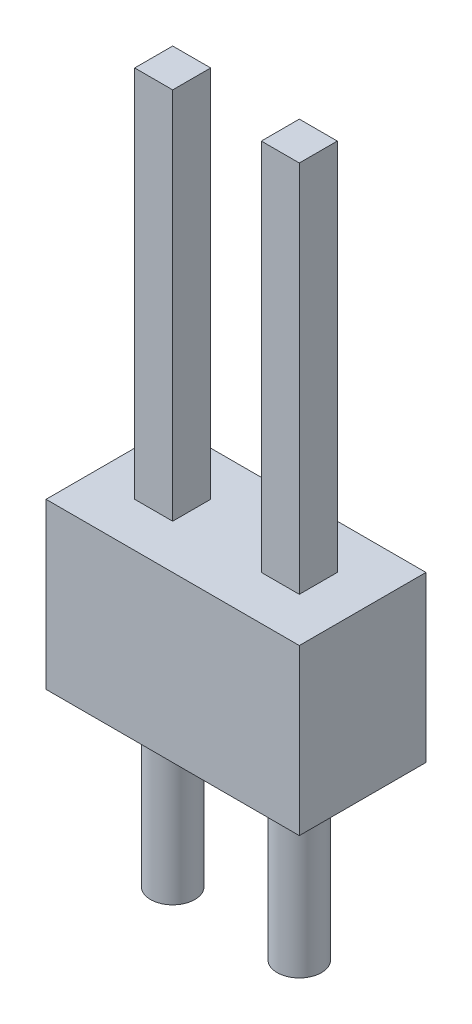
ISO-10303-21;
HEADER;
FILE_DESCRIPTION(('STEP AP214'),'2;1');
FILE_NAME('part.step','',(''),(''),'','','');
FILE_SCHEMA(('AUTOMOTIVE_DESIGN { 1 0 10303 214 1 1 1 1 }'));
ENDSEC;
DATA;
#1=APPLICATION_CONTEXT('core data for automotive mechanical design processes');
#2=APPLICATION_PROTOCOL_DEFINITION('international standard','automotive_design',2000,#1);
#3=PRODUCT_CONTEXT('',#1,'mechanical');
#4=PRODUCT('Part','Part','',(#3));
#5=PRODUCT_RELATED_PRODUCT_CATEGORY('part','',(#4));
#6=PRODUCT_DEFINITION_FORMATION('','',#4);
#7=PRODUCT_DEFINITION_CONTEXT('part definition',#1,'design');
#8=PRODUCT_DEFINITION('design','',#6,#7);
#9=PRODUCT_DEFINITION_SHAPE('','',#8);
#10=(LENGTH_UNIT() NAMED_UNIT(*) SI_UNIT(.MILLI.,.METRE.));
#11=(NAMED_UNIT(*) PLANE_ANGLE_UNIT() SI_UNIT($,.RADIAN.));
#12=(NAMED_UNIT(*) SI_UNIT($,.STERADIAN.) SOLID_ANGLE_UNIT());
#13=UNCERTAINTY_MEASURE_WITH_UNIT(LENGTH_MEASURE(1.E-05),#10,'distance_accuracy_value','');
#14=(GEOMETRIC_REPRESENTATION_CONTEXT(3) GLOBAL_UNCERTAINTY_ASSIGNED_CONTEXT((#13)) GLOBAL_UNIT_ASSIGNED_CONTEXT((#10,
#11,#12)) REPRESENTATION_CONTEXT('',''));
#15=CARTESIAN_POINT('',(0.,0.,0.));
#16=DIRECTION('',(0.,0.,1.));
#17=DIRECTION('',(1.,0.,0.));
#18=AXIS2_PLACEMENT_3D('',#15,#16,#17);
#19=CARTESIAN_POINT('',(2.159,0.,-0.381));
#20=DIRECTION('',(0.,0.,-1.));
#21=DIRECTION('',(-1.,0.,0.));
#22=AXIS2_PLACEMENT_3D('',#19,#20,#21);
#23=PLANE('',#22);
#24=DIRECTION('',(1.,0.,0.));
#25=VECTOR('',#24,1.);
#26=CARTESIAN_POINT('',(2.54,10.795,-0.381));
#27=LINE('',#26,#25);
#28=CARTESIAN_POINT('',(2.921,10.795,-0.381));
#29=VERTEX_POINT('',#28);
#30=CARTESIAN_POINT('',(2.159,10.795,-0.381));
#31=VERTEX_POINT('',#30);
#32=EDGE_CURVE('E124',#29,#31,#27,.F.);
#33=ORIENTED_EDGE('',*,*,#32,.F.);
#34=DIRECTION('',(0.,1.,0.));
#35=VECTOR('',#34,1.);
#36=CARTESIAN_POINT('',(2.921,0.,-0.381));
#37=LINE('',#36,#35);
#38=CARTESIAN_POINT('',(2.921,3.302,-0.381));
#39=VERTEX_POINT('',#38);
#40=EDGE_CURVE('E102',#39,#29,#37,.T.);
#41=ORIENTED_EDGE('',*,*,#40,.F.);
#42=DIRECTION('',(-1.,0.,0.));
#43=VECTOR('',#42,1.);
#44=CARTESIAN_POINT('',(2.159,3.302,-0.381));
#45=LINE('',#44,#43);
#46=CARTESIAN_POINT('',(2.159,3.302,-0.381));
#47=VERTEX_POINT('',#46);
#48=EDGE_CURVE('E115',#39,#47,#45,.T.);
#49=ORIENTED_EDGE('',*,*,#48,.T.);
#50=DIRECTION('',(0.,1.,0.));
#51=VECTOR('',#50,1.);
#52=CARTESIAN_POINT('',(2.159,0.,-0.381));
#53=LINE('',#52,#51);
#54=EDGE_CURVE('E169',#31,#47,#53,.F.);
#55=ORIENTED_EDGE('',*,*,#54,.F.);
#56=EDGE_LOOP('',(#33,#41,#49,#55));
#57=FACE_BOUND('',#56,.T.);
#58=ADVANCED_FACE('F16',(#57),#23,.T.);
#59=CARTESIAN_POINT('',(-0.381,0.,-0.381));
#60=DIRECTION('',(0.,0.,-1.));
#61=DIRECTION('',(-1.,0.,0.));
#62=AXIS2_PLACEMENT_3D('',#59,#60,#61);
#63=PLANE('',#62);
#64=DIRECTION('',(1.,0.,0.));
#65=VECTOR('',#64,1.);
#66=CARTESIAN_POINT('',(0.,10.795,-0.381));
#67=LINE('',#66,#65);
#68=CARTESIAN_POINT('',(0.381,10.795,-0.381));
#69=VERTEX_POINT('',#68);
#70=CARTESIAN_POINT('',(-0.381,10.795,-0.381));
#71=VERTEX_POINT('',#70);
#72=EDGE_CURVE('E160',#69,#71,#67,.F.);
#73=ORIENTED_EDGE('',*,*,#72,.F.);
#74=DIRECTION('',(0.,1.,0.));
#75=VECTOR('',#74,1.);
#76=CARTESIAN_POINT('',(0.381,0.,-0.381));
#77=LINE('',#76,#75);
#78=CARTESIAN_POINT('',(0.381,3.302,-0.381));
#79=VERTEX_POINT('',#78);
#80=EDGE_CURVE('E165',#79,#69,#77,.T.);
#81=ORIENTED_EDGE('',*,*,#80,.F.);
#82=DIRECTION('',(-1.,0.,0.));
#83=VECTOR('',#82,1.);
#84=CARTESIAN_POINT('',(-0.381,3.302,-0.381));
#85=LINE('',#84,#83);
#86=CARTESIAN_POINT('',(-0.381,3.302,-0.381));
#87=VERTEX_POINT('',#86);
#88=EDGE_CURVE('E112',#79,#87,#85,.T.);
#89=ORIENTED_EDGE('',*,*,#88,.T.);
#90=DIRECTION('',(0.,1.,0.));
#91=VECTOR('',#90,1.);
#92=CARTESIAN_POINT('',(-0.381,0.,-0.381));
#93=LINE('',#92,#91);
#94=EDGE_CURVE('E145',#71,#87,#93,.F.);
#95=ORIENTED_EDGE('',*,*,#94,.F.);
#96=EDGE_LOOP('',(#73,#81,#89,#95));
#97=FACE_BOUND('',#96,.T.);
#98=ADVANCED_FACE('F292',(#97),#63,.T.);
#99=CARTESIAN_POINT('',(2.54,-3.429,0.));
#100=DIRECTION('',(0.,1.,0.));
#101=DIRECTION('',(0.,0.,1.));
#102=AXIS2_PLACEMENT_3D('',#99,#100,#101);
#103=PLANE('',#102);
#104=CARTESIAN_POINT('',(2.54,-3.429,0.));
#105=DIRECTION('',(0.,-1.,0.));
#106=DIRECTION('',(0.,0.,-1.));
#107=AXIS2_PLACEMENT_3D('',#104,#105,#106);
#108=CIRCLE('',#107,0.4445);
#109=CARTESIAN_POINT('',(2.54,-3.429,-0.4445));
#110=VERTEX_POINT('',#109);
#111=EDGE_CURVE('E19',#110,#110,#108,.F.);
#112=ORIENTED_EDGE('',*,*,#111,.F.);
#113=EDGE_LOOP('',(#112));
#114=FACE_BOUND('',#113,.T.);
#115=ADVANCED_FACE('F289',(#114),#103,.F.);
#116=CARTESIAN_POINT('',(0.,-3.429,0.));
#117=DIRECTION('',(0.,1.,0.));
#118=DIRECTION('',(0.,0.,1.));
#119=AXIS2_PLACEMENT_3D('',#116,#117,#118);
#120=PLANE('',#119);
#121=CARTESIAN_POINT('',(0.,-3.429,0.));
#122=DIRECTION('',(0.,-1.,0.));
#123=DIRECTION('',(0.,0.,-1.));
#124=AXIS2_PLACEMENT_3D('',#121,#122,#123);
#125=CIRCLE('',#124,0.4445);
#126=CARTESIAN_POINT('',(0.,-3.429,-0.4445));
#127=VERTEX_POINT('',#126);
#128=EDGE_CURVE('E138',#127,#127,#125,.F.);
#129=ORIENTED_EDGE('',*,*,#128,.F.);
#130=EDGE_LOOP('',(#129));
#131=FACE_BOUND('',#130,.T.);
#132=ADVANCED_FACE('F286',(#131),#120,.F.);
#133=CARTESIAN_POINT('',(2.921,0.,-0.381));
#134=DIRECTION('',(1.,0.,0.));
#135=DIRECTION('',(0.,0.,-1.));
#136=AXIS2_PLACEMENT_3D('',#133,#134,#135);
#137=PLANE('',#136);
#138=DIRECTION('',(0.,0.,1.));
#139=VECTOR('',#138,1.);
#140=CARTESIAN_POINT('',(2.921,10.795,0.));
#141=LINE('',#140,#139);
#142=CARTESIAN_POINT('',(2.921,10.795,0.381));
#143=VERTEX_POINT('',#142);
#144=EDGE_CURVE('E125',#143,#29,#141,.F.);
#145=ORIENTED_EDGE('',*,*,#144,.F.);
#146=DIRECTION('',(0.,1.,0.));
#147=VECTOR('',#146,1.);
#148=CARTESIAN_POINT('',(2.921,0.,0.381));
#149=LINE('',#148,#147);
#150=CARTESIAN_POINT('',(2.921,3.302,0.381));
#151=VERTEX_POINT('',#150);
#152=EDGE_CURVE('E108',#151,#143,#149,.T.);
#153=ORIENTED_EDGE('',*,*,#152,.F.);
#154=DIRECTION('',(0.,0.,-1.));
#155=VECTOR('',#154,1.);
#156=CARTESIAN_POINT('',(2.921,3.302,-0.381));
#157=LINE('',#156,#155);
#158=EDGE_CURVE('E105',#151,#39,#157,.T.);
#159=ORIENTED_EDGE('',*,*,#158,.T.);
#160=ORIENTED_EDGE('',*,*,#40,.T.);
#161=EDGE_LOOP('',(#145,#153,#159,#160));
#162=FACE_BOUND('',#161,.T.);
#163=ADVANCED_FACE('F107',(#162),#137,.T.);
#164=CARTESIAN_POINT('',(2.54,10.795,0.));
#165=DIRECTION('',(0.,1.,0.));
#166=DIRECTION('',(0.,0.,1.));
#167=AXIS2_PLACEMENT_3D('',#164,#165,#166);
#168=PLANE('',#167);
#169=ORIENTED_EDGE('',*,*,#144,.T.);
#170=ORIENTED_EDGE('',*,*,#32,.T.);
#171=DIRECTION('',(0.,0.,1.));
#172=VECTOR('',#171,1.);
#173=CARTESIAN_POINT('',(2.159,10.795,0.381));
#174=LINE('',#173,#172);
#175=CARTESIAN_POINT('',(2.159,10.795,0.381));
#176=VERTEX_POINT('',#175);
#177=EDGE_CURVE('E171',#176,#31,#174,.F.);
#178=ORIENTED_EDGE('',*,*,#177,.F.);
#179=DIRECTION('',(1.,0.,0.));
#180=VECTOR('',#179,1.);
#181=CARTESIAN_POINT('',(2.921,10.795,0.381));
#182=LINE('',#181,#180);
#183=EDGE_CURVE('E142',#143,#176,#182,.F.);
#184=ORIENTED_EDGE('',*,*,#183,.F.);
#185=EDGE_LOOP('',(#169,#170,#178,#184));
#186=FACE_BOUND('',#185,.T.);
#187=ADVANCED_FACE('F176',(#186),#168,.T.);
#188=CARTESIAN_POINT('',(2.159,0.,0.381));
#189=DIRECTION('',(-1.,0.,0.));
#190=DIRECTION('',(0.,0.,1.));
#191=AXIS2_PLACEMENT_3D('',#188,#189,#190);
#192=PLANE('',#191);
#193=ORIENTED_EDGE('',*,*,#177,.T.);
#194=ORIENTED_EDGE('',*,*,#54,.T.);
#195=DIRECTION('',(0.,0.,1.));
#196=VECTOR('',#195,1.);
#197=CARTESIAN_POINT('',(2.159,3.302,0.381));
#198=LINE('',#197,#196);
#199=CARTESIAN_POINT('',(2.159,3.302,0.381));
#200=VERTEX_POINT('',#199);
#201=EDGE_CURVE('E118',#47,#200,#198,.T.);
#202=ORIENTED_EDGE('',*,*,#201,.T.);
#203=DIRECTION('',(0.,1.,0.));
#204=VECTOR('',#203,1.);
#205=CARTESIAN_POINT('',(2.159,0.,0.381));
#206=LINE('',#205,#204);
#207=EDGE_CURVE('E182',#176,#200,#206,.F.);
#208=ORIENTED_EDGE('',*,*,#207,.F.);
#209=EDGE_LOOP('',(#193,#194,#202,#208));
#210=FACE_BOUND('',#209,.T.);
#211=ADVANCED_FACE('F180',(#210),#192,.T.);
#212=CARTESIAN_POINT('',(0.381,0.,-0.381));
#213=DIRECTION('',(1.,0.,0.));
#214=DIRECTION('',(0.,0.,-1.));
#215=AXIS2_PLACEMENT_3D('',#212,#213,#214);
#216=PLANE('',#215);
#217=DIRECTION('',(0.,0.,1.));
#218=VECTOR('',#217,1.);
#219=CARTESIAN_POINT('',(0.381,10.795,0.));
#220=LINE('',#219,#218);
#221=CARTESIAN_POINT('',(0.381,10.795,0.381));
#222=VERTEX_POINT('',#221);
#223=EDGE_CURVE('E162',#222,#69,#220,.F.);
#224=ORIENTED_EDGE('',*,*,#223,.F.);
#225=DIRECTION('',(0.,1.,0.));
#226=VECTOR('',#225,1.);
#227=CARTESIAN_POINT('',(0.381,0.,0.381));
#228=LINE('',#227,#226);
#229=CARTESIAN_POINT('',(0.381,3.302,0.381));
#230=VERTEX_POINT('',#229);
#231=EDGE_CURVE('E184',#230,#222,#228,.T.);
#232=ORIENTED_EDGE('',*,*,#231,.F.);
#233=DIRECTION('',(0.,0.,-1.));
#234=VECTOR('',#233,1.);
#235=CARTESIAN_POINT('',(0.381,3.302,-0.381));
#236=LINE('',#235,#234);
#237=EDGE_CURVE('E167',#230,#79,#236,.T.);
#238=ORIENTED_EDGE('',*,*,#237,.T.);
#239=ORIENTED_EDGE('',*,*,#80,.T.);
#240=EDGE_LOOP('',(#224,#232,#238,#239));
#241=FACE_BOUND('',#240,.T.);
#242=ADVANCED_FACE('F275',(#241),#216,.T.);
#243=CARTESIAN_POINT('',(0.,10.795,0.));
#244=DIRECTION('',(0.,1.,0.));
#245=DIRECTION('',(0.,0.,1.));
#246=AXIS2_PLACEMENT_3D('',#243,#244,#245);
#247=PLANE('',#246);
#248=ORIENTED_EDGE('',*,*,#223,.T.);
#249=ORIENTED_EDGE('',*,*,#72,.T.);
#250=DIRECTION('',(0.,0.,1.));
#251=VECTOR('',#250,1.);
#252=CARTESIAN_POINT('',(-0.381,10.795,0.381));
#253=LINE('',#252,#251);
#254=CARTESIAN_POINT('',(-0.381,10.795,0.381));
#255=VERTEX_POINT('',#254);
#256=EDGE_CURVE('E149',#255,#71,#253,.F.);
#257=ORIENTED_EDGE('',*,*,#256,.F.);
#258=DIRECTION('',(1.,0.,0.));
#259=VECTOR('',#258,1.);
#260=CARTESIAN_POINT('',(0.381,10.795,0.381));
#261=LINE('',#260,#259);
#262=EDGE_CURVE('E186',#222,#255,#261,.F.);
#263=ORIENTED_EDGE('',*,*,#262,.F.);
#264=EDGE_LOOP('',(#248,#249,#257,#263));
#265=FACE_BOUND('',#264,.T.);
#266=ADVANCED_FACE('F272',(#265),#247,.T.);
#267=CARTESIAN_POINT('',(-0.381,0.,0.381));
#268=DIRECTION('',(-1.,0.,0.));
#269=DIRECTION('',(0.,0.,1.));
#270=AXIS2_PLACEMENT_3D('',#267,#268,#269);
#271=PLANE('',#270);
#272=ORIENTED_EDGE('',*,*,#256,.T.);
#273=ORIENTED_EDGE('',*,*,#94,.T.);
#274=DIRECTION('',(0.,0.,1.));
#275=VECTOR('',#274,1.);
#276=CARTESIAN_POINT('',(-0.381,3.302,0.381));
#277=LINE('',#276,#275);
#278=CARTESIAN_POINT('',(-0.381,3.302,0.381));
#279=VERTEX_POINT('',#278);
#280=EDGE_CURVE('E155',#87,#279,#277,.T.);
#281=ORIENTED_EDGE('',*,*,#280,.T.);
#282=DIRECTION('',(0.,1.,0.));
#283=VECTOR('',#282,1.);
#284=CARTESIAN_POINT('',(-0.381,0.,0.381));
#285=LINE('',#284,#283);
#286=EDGE_CURVE('E190',#255,#279,#285,.F.);
#287=ORIENTED_EDGE('',*,*,#286,.F.);
#288=EDGE_LOOP('',(#272,#273,#281,#287));
#289=FACE_BOUND('',#288,.T.);
#290=ADVANCED_FACE('F268',(#289),#271,.T.);
#291=CARTESIAN_POINT('',(2.54,0.,0.));
#292=DIRECTION('',(0.,-1.,0.));
#293=DIRECTION('',(0.,0.,-1.));
#294=AXIS2_PLACEMENT_3D('',#291,#292,#293);
#295=CYLINDRICAL_SURFACE('',#294,0.4445);
#296=CARTESIAN_POINT('',(2.54,0.,0.));
#297=DIRECTION('',(0.,-1.,0.));
#298=DIRECTION('',(0.,0.,-1.));
#299=AXIS2_PLACEMENT_3D('',#296,#297,#298);
#300=CIRCLE('',#299,0.4445);
#301=CARTESIAN_POINT('',(2.54,0.,-0.4445));
#302=VERTEX_POINT('',#301);
#303=EDGE_CURVE('E135',#302,#302,#300,.F.);
#304=ORIENTED_EDGE('',*,*,#303,.F.);
#305=EDGE_LOOP('',(#304));
#306=FACE_BOUND('',#305,.T.);
#307=ORIENTED_EDGE('',*,*,#111,.T.);
#308=EDGE_LOOP('',(#307));
#309=FACE_BOUND('',#308,.T.);
#310=ADVANCED_FACE('F264',(#306,#309),#295,.T.);
#311=CARTESIAN_POINT('',(0.,0.,0.));
#312=DIRECTION('',(0.,-1.,0.));
#313=DIRECTION('',(0.,0.,-1.));
#314=AXIS2_PLACEMENT_3D('',#311,#312,#313);
#315=CYLINDRICAL_SURFACE('',#314,0.4445);
#316=CARTESIAN_POINT('',(0.,0.,0.));
#317=DIRECTION('',(0.,-1.,0.));
#318=DIRECTION('',(0.,0.,-1.));
#319=AXIS2_PLACEMENT_3D('',#316,#317,#318);
#320=CIRCLE('',#319,0.4445);
#321=CARTESIAN_POINT('',(0.,0.,-0.4445));
#322=VERTEX_POINT('',#321);
#323=EDGE_CURVE('E131',#322,#322,#320,.F.);
#324=ORIENTED_EDGE('',*,*,#323,.F.);
#325=EDGE_LOOP('',(#324));
#326=FACE_BOUND('',#325,.T.);
#327=ORIENTED_EDGE('',*,*,#128,.T.);
#328=EDGE_LOOP('',(#327));
#329=FACE_BOUND('',#328,.T.);
#330=ADVANCED_FACE('F261',(#326,#329),#315,.T.);
#331=CARTESIAN_POINT('',(2.921,0.,0.381));
#332=DIRECTION('',(0.,0.,1.));
#333=DIRECTION('',(1.,0.,0.));
#334=AXIS2_PLACEMENT_3D('',#331,#332,#333);
#335=PLANE('',#334);
#336=ORIENTED_EDGE('',*,*,#183,.T.);
#337=ORIENTED_EDGE('',*,*,#207,.T.);
#338=DIRECTION('',(1.,0.,0.));
#339=VECTOR('',#338,1.);
#340=CARTESIAN_POINT('',(-1.27,3.302,0.381));
#341=LINE('',#340,#339);
#342=EDGE_CURVE('E201',#151,#200,#341,.F.);
#343=ORIENTED_EDGE('',*,*,#342,.F.);
#344=ORIENTED_EDGE('',*,*,#152,.T.);
#345=EDGE_LOOP('',(#336,#337,#343,#344));
#346=FACE_BOUND('',#345,.T.);
#347=ADVANCED_FACE('F257',(#346),#335,.T.);
#348=CARTESIAN_POINT('',(0.381,0.,0.381));
#349=DIRECTION('',(0.,0.,1.));
#350=DIRECTION('',(1.,0.,0.));
#351=AXIS2_PLACEMENT_3D('',#348,#349,#350);
#352=PLANE('',#351);
#353=ORIENTED_EDGE('',*,*,#262,.T.);
#354=ORIENTED_EDGE('',*,*,#286,.T.);
#355=DIRECTION('',(1.,0.,0.));
#356=VECTOR('',#355,1.);
#357=CARTESIAN_POINT('',(-1.27,3.302,0.381));
#358=LINE('',#357,#356);
#359=EDGE_CURVE('E203',#230,#279,#358,.F.);
#360=ORIENTED_EDGE('',*,*,#359,.F.);
#361=ORIENTED_EDGE('',*,*,#231,.T.);
#362=EDGE_LOOP('',(#353,#354,#360,#361));
#363=FACE_BOUND('',#362,.T.);
#364=ADVANCED_FACE('F253',(#363),#352,.T.);
#365=CARTESIAN_POINT('',(0.,1.651,1.27));
#366=DIRECTION('',(0.,0.,1.));
#367=DIRECTION('',(1.,0.,0.));
#368=AXIS2_PLACEMENT_3D('',#365,#366,#367);
#369=PLANE('',#368);
#370=DIRECTION('',(1.,0.,0.));
#371=VECTOR('',#370,1.);
#372=CARTESIAN_POINT('',(1.27,0.,1.27));
#373=LINE('',#372,#371);
#374=CARTESIAN_POINT('',(3.81,0.,1.27));
#375=VERTEX_POINT('',#374);
#376=CARTESIAN_POINT('',(-1.27,0.,1.27));
#377=VERTEX_POINT('',#376);
#378=EDGE_CURVE('E137',#375,#377,#373,.F.);
#379=ORIENTED_EDGE('',*,*,#378,.F.);
#380=DIRECTION('',(0.,1.,0.));
#381=VECTOR('',#380,1.);
#382=CARTESIAN_POINT('',(3.81,3.302,1.27));
#383=LINE('',#382,#381);
#384=CARTESIAN_POINT('',(3.81,3.302,1.27));
#385=VERTEX_POINT('',#384);
#386=EDGE_CURVE('E134',#385,#375,#383,.F.);
#387=ORIENTED_EDGE('',*,*,#386,.F.);
#388=DIRECTION('',(1.,0.,0.));
#389=VECTOR('',#388,1.);
#390=CARTESIAN_POINT('',(-1.27,3.302,1.27));
#391=LINE('',#390,#389);
#392=CARTESIAN_POINT('',(-1.27,3.302,1.27));
#393=VERTEX_POINT('',#392);
#394=EDGE_CURVE('E197',#393,#385,#391,.T.);
#395=ORIENTED_EDGE('',*,*,#394,.F.);
#396=DIRECTION('',(0.,1.,0.));
#397=VECTOR('',#396,1.);
#398=CARTESIAN_POINT('',(-1.27,0.,1.27));
#399=LINE('',#398,#397);
#400=EDGE_CURVE('E206',#377,#393,#399,.T.);
#401=ORIENTED_EDGE('',*,*,#400,.F.);
#402=EDGE_LOOP('',(#379,#387,#395,#401));
#403=FACE_BOUND('',#402,.T.);
#404=ADVANCED_FACE('F249',(#403),#369,.T.);
#405=CARTESIAN_POINT('',(1.27,0.,0.));
#406=DIRECTION('',(0.,-1.,0.));
#407=DIRECTION('',(0.,0.,-1.));
#408=AXIS2_PLACEMENT_3D('',#405,#406,#407);
#409=PLANE('',#408);
#410=ORIENTED_EDGE('',*,*,#323,.T.);
#411=EDGE_LOOP('',(#410));
#412=FACE_BOUND('',#411,.T.);
#413=ORIENTED_EDGE('',*,*,#303,.T.);
#414=EDGE_LOOP('',(#413));
#415=FACE_BOUND('',#414,.T.);
#416=DIRECTION('',(1.,0.,0.));
#417=VECTOR('',#416,1.);
#418=CARTESIAN_POINT('',(0.,0.,-1.27));
#419=LINE('',#418,#417);
#420=CARTESIAN_POINT('',(-1.27,0.,-1.27));
#421=VERTEX_POINT('',#420);
#422=CARTESIAN_POINT('',(3.81,0.,-1.27));
#423=VERTEX_POINT('',#422);
#424=EDGE_CURVE('E212',#421,#423,#419,.T.);
#425=ORIENTED_EDGE('',*,*,#424,.T.);
#426=DIRECTION('',(0.,0.,-1.));
#427=VECTOR('',#426,1.);
#428=CARTESIAN_POINT('',(3.81,0.,0.));
#429=LINE('',#428,#427);
#430=EDGE_CURVE('E195',#375,#423,#429,.T.);
#431=ORIENTED_EDGE('',*,*,#430,.F.);
#432=ORIENTED_EDGE('',*,*,#378,.T.);
#433=DIRECTION('',(0.,0.,1.));
#434=VECTOR('',#433,1.);
#435=CARTESIAN_POINT('',(-1.27,0.,0.));
#436=LINE('',#435,#434);
#437=EDGE_CURVE('E209',#421,#377,#436,.T.);
#438=ORIENTED_EDGE('',*,*,#437,.F.);
#439=EDGE_LOOP('',(#425,#431,#432,#438));
#440=FACE_BOUND('',#439,.T.);
#441=ADVANCED_FACE('F230',(#412,#415,#440),#409,.T.);
#442=CARTESIAN_POINT('',(3.81,3.302,0.));
#443=DIRECTION('',(1.,0.,0.));
#444=DIRECTION('',(0.,0.,-1.));
#445=AXIS2_PLACEMENT_3D('',#442,#443,#444);
#446=PLANE('',#445);
#447=DIRECTION('',(0.,1.,0.));
#448=VECTOR('',#447,1.);
#449=CARTESIAN_POINT('',(3.81,1.651,-1.27));
#450=LINE('',#449,#448);
#451=CARTESIAN_POINT('',(3.81,3.302,-1.27));
#452=VERTEX_POINT('',#451);
#453=EDGE_CURVE('E215',#423,#452,#450,.T.);
#454=ORIENTED_EDGE('',*,*,#453,.T.);
#455=DIRECTION('',(0.,0.,1.));
#456=VECTOR('',#455,1.);
#457=CARTESIAN_POINT('',(3.81,3.302,0.));
#458=LINE('',#457,#456);
#459=EDGE_CURVE('E199',#385,#452,#458,.F.);
#460=ORIENTED_EDGE('',*,*,#459,.F.);
#461=ORIENTED_EDGE('',*,*,#386,.T.);
#462=ORIENTED_EDGE('',*,*,#430,.T.);
#463=EDGE_LOOP('',(#454,#460,#461,#462));
#464=FACE_BOUND('',#463,.T.);
#465=ADVANCED_FACE('F225',(#464),#446,.T.);
#466=CARTESIAN_POINT('',(-1.27,3.302,0.));
#467=DIRECTION('',(0.,1.,0.));
#468=DIRECTION('',(0.,0.,1.));
#469=AXIS2_PLACEMENT_3D('',#466,#467,#468);
#470=PLANE('',#469);
#471=ORIENTED_EDGE('',*,*,#237,.F.);
#472=ORIENTED_EDGE('',*,*,#359,.T.);
#473=ORIENTED_EDGE('',*,*,#280,.F.);
#474=ORIENTED_EDGE('',*,*,#88,.F.);
#475=EDGE_LOOP('',(#471,#472,#473,#474));
#476=FACE_BOUND('',#475,.T.);
#477=ORIENTED_EDGE('',*,*,#158,.F.);
#478=ORIENTED_EDGE('',*,*,#342,.T.);
#479=ORIENTED_EDGE('',*,*,#201,.F.);
#480=ORIENTED_EDGE('',*,*,#48,.F.);
#481=EDGE_LOOP('',(#477,#478,#479,#480));
#482=FACE_BOUND('',#481,.T.);
#483=DIRECTION('',(1.,0.,0.));
#484=VECTOR('',#483,1.);
#485=CARTESIAN_POINT('',(0.,3.302,-1.27));
#486=LINE('',#485,#484);
#487=CARTESIAN_POINT('',(-1.27,3.302,-1.27));
#488=VERTEX_POINT('',#487);
#489=EDGE_CURVE('E25',#452,#488,#486,.F.);
#490=ORIENTED_EDGE('',*,*,#489,.T.);
#491=DIRECTION('',(0.,0.,1.));
#492=VECTOR('',#491,1.);
#493=CARTESIAN_POINT('',(-1.27,3.302,0.));
#494=LINE('',#493,#492);
#495=EDGE_CURVE('E33',#393,#488,#494,.F.);
#496=ORIENTED_EDGE('',*,*,#495,.F.);
#497=ORIENTED_EDGE('',*,*,#394,.T.);
#498=ORIENTED_EDGE('',*,*,#459,.T.);
#499=EDGE_LOOP('',(#490,#496,#497,#498));
#500=FACE_BOUND('',#499,.T.);
#501=ADVANCED_FACE('F116',(#476,#482,#500),#470,.T.);
#502=CARTESIAN_POINT('',(-1.27,0.,0.));
#503=DIRECTION('',(-1.,0.,0.));
#504=DIRECTION('',(0.,0.,1.));
#505=AXIS2_PLACEMENT_3D('',#502,#503,#504);
#506=PLANE('',#505);
#507=DIRECTION('',(0.,1.,0.));
#508=VECTOR('',#507,1.);
#509=CARTESIAN_POINT('',(-1.27,1.651,-1.27));
#510=LINE('',#509,#508);
#511=EDGE_CURVE('E11',#488,#421,#510,.F.);
#512=ORIENTED_EDGE('',*,*,#511,.T.);
#513=ORIENTED_EDGE('',*,*,#437,.T.);
#514=ORIENTED_EDGE('',*,*,#400,.T.);
#515=ORIENTED_EDGE('',*,*,#495,.T.);
#516=EDGE_LOOP('',(#512,#513,#514,#515));
#517=FACE_BOUND('',#516,.T.);
#518=ADVANCED_FACE('F233',(#517),#506,.T.);
#519=CARTESIAN_POINT('',(0.,1.651,-1.27));
#520=DIRECTION('',(0.,0.,1.));
#521=DIRECTION('',(1.,0.,0.));
#522=AXIS2_PLACEMENT_3D('',#519,#520,#521);
#523=PLANE('',#522);
#524=ORIENTED_EDGE('',*,*,#489,.F.);
#525=ORIENTED_EDGE('',*,*,#453,.F.);
#526=ORIENTED_EDGE('',*,*,#424,.F.);
#527=ORIENTED_EDGE('',*,*,#511,.F.);
#528=EDGE_LOOP('',(#524,#525,#526,#527));
#529=FACE_BOUND('',#528,.T.);
#530=ADVANCED_FACE('F223',(#529),#523,.F.);
#531=CLOSED_SHELL('',(#58,#98,#115,#132,#163,#187,#211,#242,#266,#290,#310,#330,#347,#364,#404,
#441,#465,#501,#518,#530));
#532=MANIFOLD_SOLID_BREP('B1',#531);
#533=ADVANCED_BREP_SHAPE_REPRESENTATION('',(#18,#532),#14);
#534=SHAPE_DEFINITION_REPRESENTATION(#9,#533);
ENDSEC;
END-ISO-10303-21;
